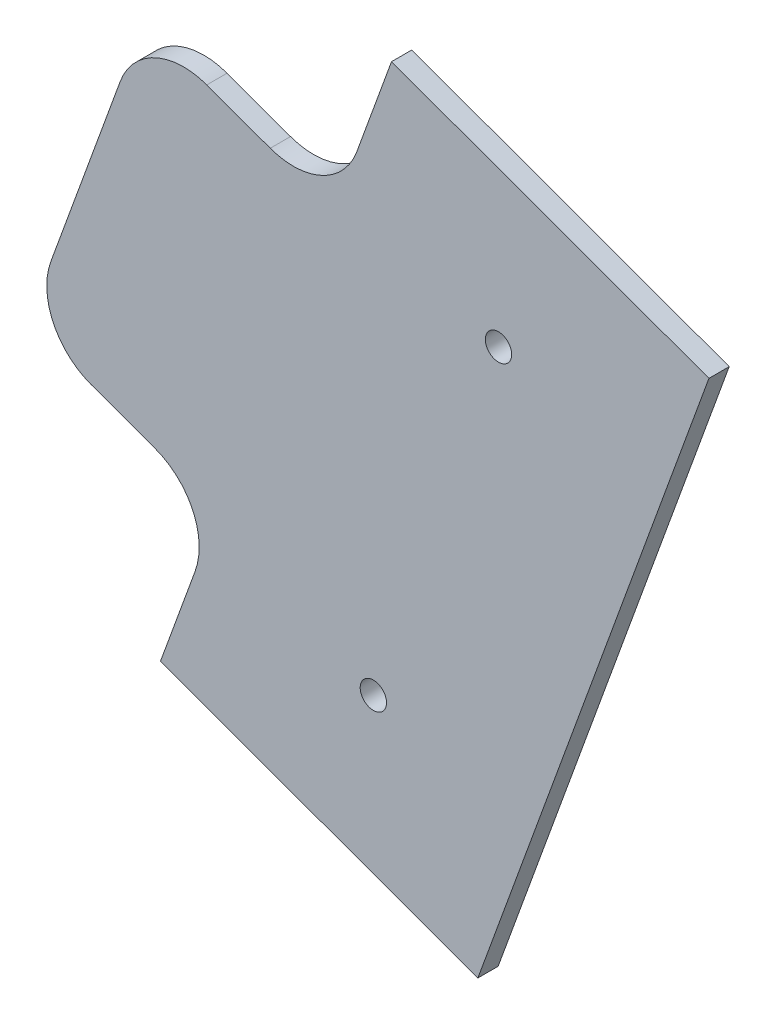
ISO-10303-21;
HEADER;
FILE_DESCRIPTION(('STEP AP214'),'2;1');
FILE_NAME('part.step','',(''),(''),'','','');
FILE_SCHEMA(('AUTOMOTIVE_DESIGN { 1 0 10303 214 1 1 1 1 }'));
ENDSEC;
DATA;
#1=APPLICATION_CONTEXT('core data for automotive mechanical design processes');
#2=APPLICATION_PROTOCOL_DEFINITION('international standard','automotive_design',2000,#1);
#3=PRODUCT_CONTEXT('',#1,'mechanical');
#4=PRODUCT('Part','Part','',(#3));
#5=PRODUCT_RELATED_PRODUCT_CATEGORY('part','',(#4));
#6=PRODUCT_DEFINITION_FORMATION('','',#4);
#7=PRODUCT_DEFINITION_CONTEXT('part definition',#1,'design');
#8=PRODUCT_DEFINITION('design','',#6,#7);
#9=PRODUCT_DEFINITION_SHAPE('','',#8);
#10=(LENGTH_UNIT() NAMED_UNIT(*) SI_UNIT(.MILLI.,.METRE.));
#11=(NAMED_UNIT(*) PLANE_ANGLE_UNIT() SI_UNIT($,.RADIAN.));
#12=(NAMED_UNIT(*) SI_UNIT($,.STERADIAN.) SOLID_ANGLE_UNIT());
#13=UNCERTAINTY_MEASURE_WITH_UNIT(LENGTH_MEASURE(1.E-05),#10,'distance_accuracy_value','');
#14=(GEOMETRIC_REPRESENTATION_CONTEXT(3) GLOBAL_UNCERTAINTY_ASSIGNED_CONTEXT((#13)) GLOBAL_UNIT_ASSIGNED_CONTEXT((#10,
#11,#12)) REPRESENTATION_CONTEXT('',''));
#15=CARTESIAN_POINT('',(0.,0.,0.));
#16=DIRECTION('',(0.,0.,1.));
#17=DIRECTION('',(1.,0.,0.));
#18=AXIS2_PLACEMENT_3D('',#15,#16,#17);
#19=CARTESIAN_POINT('',(319.823700532038,684.166597364594,3.));
#20=DIRECTION('',(0.939692620785909,-0.342020143325666,0.));
#21=DIRECTION('',(0.342020143325666,0.939692620785909,0.));
#22=AXIS2_PLACEMENT_3D('',#19,#20,#21);
#23=PLANE('',#22);
#24=DIRECTION('',(-0.342020143325666,-0.939692620785909,0.));
#25=VECTOR('',#24,1.);
#26=CARTESIAN_POINT('',(319.823700532038,684.166597364594,3.));
#27=LINE('',#26,#25);
#28=CARTESIAN_POINT('',(324.954002681923,698.261986676383,3.));
#29=VERTEX_POINT('',#28);
#30=CARTESIAN_POINT('',(319.823700532038,684.166597364594,3.));
#31=VERTEX_POINT('',#30);
#32=EDGE_CURVE('E148',#29,#31,#27,.T.);
#33=ORIENTED_EDGE('',*,*,#32,.F.);
#34=DIRECTION('',(0.,0.,1.));
#35=VECTOR('',#34,1.);
#36=CARTESIAN_POINT('',(324.954002681923,698.261986676383,3.));
#37=LINE('',#36,#35);
#38=CARTESIAN_POINT('',(324.954002681923,698.261986676383,0.));
#39=VERTEX_POINT('',#38);
#40=EDGE_CURVE('E185',#29,#39,#37,.F.);
#41=ORIENTED_EDGE('',*,*,#40,.T.);
#42=DIRECTION('',(-0.342020143325666,-0.939692620785909,0.));
#43=VECTOR('',#42,1.);
#44=CARTESIAN_POINT('',(319.823700532038,684.166597364594,0.));
#45=LINE('',#44,#43);
#46=CARTESIAN_POINT('',(319.823700532038,684.166597364594,0.));
#47=VERTEX_POINT('',#46);
#48=EDGE_CURVE('E211',#39,#47,#45,.T.);
#49=ORIENTED_EDGE('',*,*,#48,.T.);
#50=DIRECTION('',(0.,0.,-1.));
#51=VECTOR('',#50,1.);
#52=CARTESIAN_POINT('',(319.823700532038,684.166597364594,3.));
#53=LINE('',#52,#51);
#54=EDGE_CURVE('E217',#31,#47,#53,.T.);
#55=ORIENTED_EDGE('',*,*,#54,.F.);
#56=EDGE_LOOP('',(#33,#41,#49,#55));
#57=FACE_BOUND('',#56,.T.);
#58=ADVANCED_FACE('F41',(#57),#23,.F.);
#59=CARTESIAN_POINT('',(366.808331571333,667.065590198311,3.));
#60=DIRECTION('',(0.342020143325665,0.93969262078591,0.));
#61=DIRECTION('',(-0.93969262078591,0.342020143325665,0.));
#62=AXIS2_PLACEMENT_3D('',#59,#60,#61);
#63=PLANE('',#62);
#64=DIRECTION('',(0.93969262078591,-0.342020143325665,0.));
#65=VECTOR('',#64,1.);
#66=CARTESIAN_POINT('',(366.808331571333,667.065590198311,0.));
#67=LINE('',#66,#65);
#68=CARTESIAN_POINT('',(366.808331571333,667.065590198311,0.));
#69=VERTEX_POINT('',#68);
#70=EDGE_CURVE('E156',#47,#69,#67,.T.);
#71=ORIENTED_EDGE('',*,*,#70,.T.);
#72=DIRECTION('',(0.,0.,-1.));
#73=VECTOR('',#72,1.);
#74=CARTESIAN_POINT('',(366.808331571333,667.065590198311,3.));
#75=LINE('',#74,#73);
#76=CARTESIAN_POINT('',(366.808331571333,667.065590198311,3.));
#77=VERTEX_POINT('',#76);
#78=EDGE_CURVE('E135',#77,#69,#75,.T.);
#79=ORIENTED_EDGE('',*,*,#78,.F.);
#80=DIRECTION('',(0.93969262078591,-0.342020143325665,0.));
#81=VECTOR('',#80,1.);
#82=CARTESIAN_POINT('',(366.808331571333,667.065590198311,3.));
#83=LINE('',#82,#81);
#84=EDGE_CURVE('E142',#31,#77,#83,.T.);
#85=ORIENTED_EDGE('',*,*,#84,.F.);
#86=ORIENTED_EDGE('',*,*,#54,.T.);
#87=EDGE_LOOP('',(#71,#79,#85,#86));
#88=FACE_BOUND('',#87,.T.);
#89=ADVANCED_FACE('F154',(#88),#63,.F.);
#90=CARTESIAN_POINT('',(366.808331571333,667.065590198311,3.));
#91=DIRECTION('',(-0.939692620785909,0.342020143325666,0.));
#92=DIRECTION('',(-0.342020143325666,-0.939692620785909,0.));
#93=AXIS2_PLACEMENT_3D('',#90,#91,#92);
#94=PLANE('',#93);
#95=DIRECTION('',(0.342020143325666,0.939692620785909,0.));
#96=VECTOR('',#95,1.);
#97=CARTESIAN_POINT('',(366.808331571333,667.065590198311,0.));
#98=LINE('',#97,#96);
#99=CARTESIAN_POINT('',(401.0103459039,761.034852276902,0.));
#100=VERTEX_POINT('',#99);
#101=EDGE_CURVE('E221',#69,#100,#98,.T.);
#102=ORIENTED_EDGE('',*,*,#101,.T.);
#103=DIRECTION('',(0.,0.,-1.));
#104=VECTOR('',#103,1.);
#105=CARTESIAN_POINT('',(401.0103459039,761.034852276902,3.));
#106=LINE('',#105,#104);
#107=CARTESIAN_POINT('',(401.0103459039,761.034852276902,3.));
#108=VERTEX_POINT('',#107);
#109=EDGE_CURVE('E138',#108,#100,#106,.T.);
#110=ORIENTED_EDGE('',*,*,#109,.F.);
#111=DIRECTION('',(0.342020143325666,0.939692620785909,0.));
#112=VECTOR('',#111,1.);
#113=CARTESIAN_POINT('',(366.808331571333,667.065590198311,3.));
#114=LINE('',#113,#112);
#115=EDGE_CURVE('E131',#77,#108,#114,.T.);
#116=ORIENTED_EDGE('',*,*,#115,.F.);
#117=ORIENTED_EDGE('',*,*,#78,.T.);
#118=EDGE_LOOP('',(#102,#110,#116,#117));
#119=FACE_BOUND('',#118,.T.);
#120=ADVANCED_FACE('F133',(#119),#94,.F.);
#121=CARTESIAN_POINT('',(401.0103459039,761.034852276902,3.));
#122=DIRECTION('',(-0.342020143325665,-0.93969262078591,0.));
#123=DIRECTION('',(0.93969262078591,-0.342020143325665,0.));
#124=AXIS2_PLACEMENT_3D('',#121,#122,#123);
#125=PLANE('',#124);
#126=DIRECTION('',(-0.93969262078591,0.342020143325665,0.));
#127=VECTOR('',#126,1.);
#128=CARTESIAN_POINT('',(401.0103459039,761.034852276902,0.));
#129=LINE('',#128,#127);
#130=CARTESIAN_POINT('',(354.025714864604,778.135859443185,0.));
#131=VERTEX_POINT('',#130);
#132=EDGE_CURVE('E213',#100,#131,#129,.T.);
#133=ORIENTED_EDGE('',*,*,#132,.T.);
#134=DIRECTION('',(0.,0.,-1.));
#135=VECTOR('',#134,1.);
#136=CARTESIAN_POINT('',(354.025714864604,778.135859443185,3.));
#137=LINE('',#136,#135);
#138=CARTESIAN_POINT('',(354.025714864604,778.135859443185,3.));
#139=VERTEX_POINT('',#138);
#140=EDGE_CURVE('E161',#139,#131,#137,.T.);
#141=ORIENTED_EDGE('',*,*,#140,.F.);
#142=DIRECTION('',(-0.93969262078591,0.342020143325665,0.));
#143=VECTOR('',#142,1.);
#144=CARTESIAN_POINT('',(401.0103459039,761.034852276902,3.));
#145=LINE('',#144,#143);
#146=EDGE_CURVE('E141',#108,#139,#145,.T.);
#147=ORIENTED_EDGE('',*,*,#146,.F.);
#148=ORIENTED_EDGE('',*,*,#109,.T.);
#149=EDGE_LOOP('',(#133,#141,#147,#148));
#150=FACE_BOUND('',#149,.T.);
#151=ADVANCED_FACE('F224',(#150),#125,.F.);
#152=CARTESIAN_POINT('',(348.895412714719,764.040470131397,0.));
#153=VERTEX_POINT('',#152);
#154=EDGE_CURVE('E152',#131,#153,#45,.T.);
#155=ORIENTED_EDGE('',*,*,#154,.T.);
#156=DIRECTION('',(0.,0.,1.));
#157=VECTOR('',#156,1.);
#158=CARTESIAN_POINT('',(348.895412714719,764.040470131397,3.));
#159=LINE('',#158,#157);
#160=CARTESIAN_POINT('',(348.895412714719,764.040470131397,3.));
#161=VERTEX_POINT('',#160);
#162=EDGE_CURVE('E187',#153,#161,#159,.T.);
#163=ORIENTED_EDGE('',*,*,#162,.T.);
#164=EDGE_CURVE('E196',#139,#161,#27,.T.);
#165=ORIENTED_EDGE('',*,*,#164,.F.);
#166=ORIENTED_EDGE('',*,*,#140,.T.);
#167=EDGE_LOOP('',(#155,#163,#165,#166));
#168=FACE_BOUND('',#167,.T.);
#169=ADVANCED_FACE('F207',(#168),#23,.F.);
#170=CARTESIAN_POINT('',(0.,0.,3.));
#171=DIRECTION('',(0.,0.,-1.));
#172=DIRECTION('',(-1.,0.,0.));
#173=AXIS2_PLACEMENT_3D('',#170,#171,#172);
#174=PLANE('',#173);
#175=CARTESIAN_POINT('',(351.338243096391,695.576064032886,3.));
#176=DIRECTION('',(0.,0.,1.));
#177=DIRECTION('',(1.,0.,0.));
#178=AXIS2_PLACEMENT_3D('',#175,#176,#177);
#179=CIRCLE('',#178,1.95000000000125);
#180=CARTESIAN_POINT('',(353.288243096393,695.576064032886,3.));
#181=VERTEX_POINT('',#180);
#182=EDGE_CURVE('E222',#181,#181,#179,.T.);
#183=ORIENTED_EDGE('',*,*,#182,.F.);
#184=EDGE_LOOP('',(#183));
#185=FACE_BOUND('',#184,.T.);
#186=CARTESIAN_POINT('',(369.862047426167,749.482173827159,3.));
#187=DIRECTION('',(0.,0.,1.));
#188=DIRECTION('',(1.,0.,0.));
#189=AXIS2_PLACEMENT_3D('',#186,#187,#188);
#190=CIRCLE('',#189,1.95000000000114);
#191=CARTESIAN_POINT('',(371.812047426168,749.482173827159,3.));
#192=VERTEX_POINT('',#191);
#193=EDGE_CURVE('E254',#192,#192,#190,.T.);
#194=ORIENTED_EDGE('',*,*,#193,.F.);
#195=EDGE_LOOP('',(#194));
#196=FACE_BOUND('',#195,.T.);
#197=DIRECTION('',(-0.93969262078591,0.342020143325665,0.));
#198=VECTOR('',#197,1.);
#199=CARTESIAN_POINT('',(345.475211281463,754.643543923538,3.));
#200=LINE('',#199,#198);
#201=CARTESIAN_POINT('',(336.078285073603,758.063745356794,3.));
#202=VERTEX_POINT('',#201);
#203=CARTESIAN_POINT('',(326.681358865744,761.483946790051,3.));
#204=VERTEX_POINT('',#203);
#205=EDGE_CURVE('E194',#202,#204,#200,.T.);
#206=ORIENTED_EDGE('',*,*,#205,.T.);
#207=CARTESIAN_POINT('',(323.261157432488,752.087020582192,3.));
#208=DIRECTION('',(0.,0.,-1.));
#209=DIRECTION('',(-1.,0.,0.));
#210=AXIS2_PLACEMENT_3D('',#207,#208,#209);
#211=CIRCLE('',#210,10.);
#212=CARTESIAN_POINT('',(313.864231224629,755.507222015448,3.));
#213=VERTEX_POINT('',#212);
#214=EDGE_CURVE('E169',#204,#213,#211,.F.);
#215=ORIENTED_EDGE('',*,*,#214,.T.);
#216=DIRECTION('',(-0.342020143325664,-0.93969262078591,0.));
#217=VECTOR('',#216,1.);
#218=CARTESIAN_POINT('',(317.284432657885,764.904148223307,3.));
#219=LINE('',#218,#217);
#220=CARTESIAN_POINT('',(303.603626924859,727.316443391871,3.));
#221=VERTEX_POINT('',#220);
#222=EDGE_CURVE('E204',#213,#221,#219,.T.);
#223=ORIENTED_EDGE('',*,*,#222,.T.);
#224=CARTESIAN_POINT('',(313.000553132718,723.896241958614,3.));
#225=DIRECTION('',(0.,0.,-1.));
#226=DIRECTION('',(-1.,0.,0.));
#227=AXIS2_PLACEMENT_3D('',#224,#225,#226);
#228=CIRCLE('',#227,10.);
#229=CARTESIAN_POINT('',(309.580351699461,714.499315750755,3.));
#230=VERTEX_POINT('',#229);
#231=EDGE_CURVE('E167',#221,#230,#228,.F.);
#232=ORIENTED_EDGE('',*,*,#231,.T.);
#233=DIRECTION('',(0.939692620785909,-0.342020143325666,0.));
#234=VECTOR('',#233,1.);
#235=CARTESIAN_POINT('',(300.183425491602,717.919517184012,3.));
#236=LINE('',#235,#234);
#237=CARTESIAN_POINT('',(318.97727790732,711.079114317499,3.));
#238=VERTEX_POINT('',#237);
#239=EDGE_CURVE('E236',#230,#238,#236,.T.);
#240=ORIENTED_EDGE('',*,*,#239,.T.);
#241=CARTESIAN_POINT('',(315.557076474063,701.682188109639,3.));
#242=DIRECTION('',(0.,0.,-1.));
#243=DIRECTION('',(-1.,0.,0.));
#244=AXIS2_PLACEMENT_3D('',#241,#242,#243);
#245=CIRCLE('',#244,10.);
#246=EDGE_CURVE('E190',#238,#29,#245,.T.);
#247=ORIENTED_EDGE('',*,*,#246,.T.);
#248=ORIENTED_EDGE('',*,*,#32,.T.);
#249=ORIENTED_EDGE('',*,*,#84,.T.);
#250=ORIENTED_EDGE('',*,*,#115,.T.);
#251=ORIENTED_EDGE('',*,*,#146,.T.);
#252=ORIENTED_EDGE('',*,*,#164,.T.);
#253=CARTESIAN_POINT('',(339.49848650686,767.460671564653,3.));
#254=DIRECTION('',(0.,0.,-1.));
#255=DIRECTION('',(-1.,0.,0.));
#256=AXIS2_PLACEMENT_3D('',#253,#254,#255);
#257=CIRCLE('',#256,10.);
#258=EDGE_CURVE('E49',#161,#202,#257,.T.);
#259=ORIENTED_EDGE('',*,*,#258,.T.);
#260=EDGE_LOOP('',(#206,#215,#223,#232,#240,#247,#248,#249,#250,#251,#252,#259));
#261=FACE_BOUND('',#260,.T.);
#262=ADVANCED_FACE('F146',(#185,#196,#261),#174,.F.);
#263=CARTESIAN_POINT('',(0.,0.,0.));
#264=DIRECTION('',(0.,0.,-1.));
#265=DIRECTION('',(-1.,0.,0.));
#266=AXIS2_PLACEMENT_3D('',#263,#264,#265);
#267=PLANE('',#266);
#268=CARTESIAN_POINT('',(351.338243096391,695.576064032886,0.));
#269=DIRECTION('',(0.,0.,-1.));
#270=DIRECTION('',(-1.,0.,0.));
#271=AXIS2_PLACEMENT_3D('',#268,#269,#270);
#272=CIRCLE('',#271,1.95000000000125);
#273=CARTESIAN_POINT('',(353.288243096393,695.576064032886,0.));
#274=VERTEX_POINT('',#273);
#275=EDGE_CURVE('E248',#274,#274,#272,.F.);
#276=ORIENTED_EDGE('',*,*,#275,.T.);
#277=EDGE_LOOP('',(#276));
#278=FACE_BOUND('',#277,.T.);
#279=CARTESIAN_POINT('',(369.862047426167,749.482173827159,0.));
#280=DIRECTION('',(0.,0.,-1.));
#281=DIRECTION('',(-1.,0.,0.));
#282=AXIS2_PLACEMENT_3D('',#279,#280,#281);
#283=CIRCLE('',#282,1.95000000000114);
#284=CARTESIAN_POINT('',(371.812047426168,749.482173827159,0.));
#285=VERTEX_POINT('',#284);
#286=EDGE_CURVE('E251',#285,#285,#283,.F.);
#287=ORIENTED_EDGE('',*,*,#286,.T.);
#288=EDGE_LOOP('',(#287));
#289=FACE_BOUND('',#288,.T.);
#290=DIRECTION('',(-0.342020143325664,-0.93969262078591,0.));
#291=VECTOR('',#290,1.);
#292=CARTESIAN_POINT('',(317.284432657885,764.904148223307,0.));
#293=LINE('',#292,#291);
#294=CARTESIAN_POINT('',(313.864231224629,755.507222015448,0.));
#295=VERTEX_POINT('',#294);
#296=CARTESIAN_POINT('',(303.603626924859,727.316443391871,0.));
#297=VERTEX_POINT('',#296);
#298=EDGE_CURVE('E242',#295,#297,#293,.T.);
#299=ORIENTED_EDGE('',*,*,#298,.F.);
#300=CARTESIAN_POINT('',(323.261157432488,752.087020582192,0.));
#301=DIRECTION('',(0.,0.,-1.));
#302=DIRECTION('',(-1.,0.,0.));
#303=AXIS2_PLACEMENT_3D('',#300,#301,#302);
#304=CIRCLE('',#303,10.);
#305=CARTESIAN_POINT('',(326.681358865744,761.483946790051,0.));
#306=VERTEX_POINT('',#305);
#307=EDGE_CURVE('E178',#295,#306,#304,.T.);
#308=ORIENTED_EDGE('',*,*,#307,.T.);
#309=DIRECTION('',(-0.93969262078591,0.342020143325665,0.));
#310=VECTOR('',#309,1.);
#311=CARTESIAN_POINT('',(345.475211281463,754.643543923538,0.));
#312=LINE('',#311,#310);
#313=CARTESIAN_POINT('',(336.078285073603,758.063745356794,0.));
#314=VERTEX_POINT('',#313);
#315=EDGE_CURVE('E240',#314,#306,#312,.T.);
#316=ORIENTED_EDGE('',*,*,#315,.F.);
#317=CARTESIAN_POINT('',(339.49848650686,767.460671564653,0.));
#318=DIRECTION('',(0.,0.,-1.));
#319=DIRECTION('',(-1.,0.,0.));
#320=AXIS2_PLACEMENT_3D('',#317,#318,#319);
#321=CIRCLE('',#320,10.);
#322=EDGE_CURVE('E11',#314,#153,#321,.F.);
#323=ORIENTED_EDGE('',*,*,#322,.T.);
#324=ORIENTED_EDGE('',*,*,#154,.F.);
#325=ORIENTED_EDGE('',*,*,#132,.F.);
#326=ORIENTED_EDGE('',*,*,#101,.F.);
#327=ORIENTED_EDGE('',*,*,#70,.F.);
#328=ORIENTED_EDGE('',*,*,#48,.F.);
#329=CARTESIAN_POINT('',(315.557076474063,701.682188109639,0.));
#330=DIRECTION('',(0.,0.,-1.));
#331=DIRECTION('',(-1.,0.,0.));
#332=AXIS2_PLACEMENT_3D('',#329,#330,#331);
#333=CIRCLE('',#332,10.);
#334=CARTESIAN_POINT('',(318.97727790732,711.079114317499,0.));
#335=VERTEX_POINT('',#334);
#336=EDGE_CURVE('E61',#39,#335,#333,.F.);
#337=ORIENTED_EDGE('',*,*,#336,.T.);
#338=DIRECTION('',(0.939692620785909,-0.342020143325666,0.));
#339=VECTOR('',#338,1.);
#340=CARTESIAN_POINT('',(300.183425491602,717.919517184012,0.));
#341=LINE('',#340,#339);
#342=CARTESIAN_POINT('',(309.580351699461,714.499315750755,0.));
#343=VERTEX_POINT('',#342);
#344=EDGE_CURVE('E238',#343,#335,#341,.T.);
#345=ORIENTED_EDGE('',*,*,#344,.F.);
#346=CARTESIAN_POINT('',(313.000553132718,723.896241958614,0.));
#347=DIRECTION('',(0.,0.,-1.));
#348=DIRECTION('',(-1.,0.,0.));
#349=AXIS2_PLACEMENT_3D('',#346,#347,#348);
#350=CIRCLE('',#349,10.);
#351=EDGE_CURVE('E176',#343,#297,#350,.T.);
#352=ORIENTED_EDGE('',*,*,#351,.T.);
#353=EDGE_LOOP('',(#299,#308,#316,#323,#324,#325,#326,#327,#328,#337,#345,#352));
#354=FACE_BOUND('',#353,.T.);
#355=ADVANCED_FACE('F226',(#278,#289,#354),#267,.T.);
#356=CARTESIAN_POINT('',(369.862047426167,749.482173827159,-0.00100000000000013));
#357=DIRECTION('',(0.,0.,1.));
#358=DIRECTION('',(1.,0.,0.));
#359=AXIS2_PLACEMENT_3D('',#356,#357,#358);
#360=CYLINDRICAL_SURFACE('',#359,1.95000000000114);
#361=CARTESIAN_POINT('',(371.812047426168,749.482173827159,0.));
#362=CARTESIAN_POINT('',(371.812047426168,749.482173827159,0.03125));
#363=CARTESIAN_POINT('',(371.812047426168,749.482173827159,0.0625));
#364=CARTESIAN_POINT('',(371.812047426168,749.482173827159,0.125));
#365=CARTESIAN_POINT('',(371.812047426168,749.482173827159,0.15625));
#366=CARTESIAN_POINT('',(371.812047426168,749.482173827159,0.21875));
#367=CARTESIAN_POINT('',(371.812047426168,749.482173827159,0.25));
#368=CARTESIAN_POINT('',(371.812047426168,749.482173827159,0.3125));
#369=CARTESIAN_POINT('',(371.812047426168,749.482173827159,0.34375));
#370=CARTESIAN_POINT('',(371.812047426168,749.482173827159,0.40625));
#371=CARTESIAN_POINT('',(371.812047426168,749.482173827159,0.4375));
#372=CARTESIAN_POINT('',(371.812047426168,749.482173827159,0.5));
#373=CARTESIAN_POINT('',(371.812047426168,749.482173827159,0.53125));
#374=CARTESIAN_POINT('',(371.812047426168,749.482173827159,0.59375));
#375=CARTESIAN_POINT('',(371.812047426168,749.482173827159,0.625));
#376=CARTESIAN_POINT('',(371.812047426168,749.482173827159,0.6875));
#377=CARTESIAN_POINT('',(371.812047426168,749.482173827159,0.71875));
#378=CARTESIAN_POINT('',(371.812047426168,749.482173827159,0.78125));
#379=CARTESIAN_POINT('',(371.812047426168,749.482173827159,0.8125));
#380=CARTESIAN_POINT('',(371.812047426168,749.482173827159,0.875));
#381=CARTESIAN_POINT('',(371.812047426168,749.482173827159,0.90625));
#382=CARTESIAN_POINT('',(371.812047426168,749.482173827159,0.96875));
#383=CARTESIAN_POINT('',(371.812047426168,749.482173827159,1.));
#384=CARTESIAN_POINT('',(371.812047426168,749.482173827159,1.0625));
#385=CARTESIAN_POINT('',(371.812047426168,749.482173827159,1.09375));
#386=CARTESIAN_POINT('',(371.812047426168,749.482173827159,1.15625));
#387=CARTESIAN_POINT('',(371.812047426168,749.482173827159,1.1875));
#388=CARTESIAN_POINT('',(371.812047426168,749.482173827159,1.25));
#389=CARTESIAN_POINT('',(371.812047426168,749.482173827159,1.28125));
#390=CARTESIAN_POINT('',(371.812047426168,749.482173827159,1.34375));
#391=CARTESIAN_POINT('',(371.812047426168,749.482173827159,1.375));
#392=CARTESIAN_POINT('',(371.812047426168,749.482173827159,1.4375));
#393=CARTESIAN_POINT('',(371.812047426168,749.482173827159,1.46875));
#394=CARTESIAN_POINT('',(371.812047426168,749.482173827159,1.53125));
#395=CARTESIAN_POINT('',(371.812047426168,749.482173827159,1.5625));
#396=CARTESIAN_POINT('',(371.812047426168,749.482173827159,1.625));
#397=CARTESIAN_POINT('',(371.812047426168,749.482173827159,1.65625));
#398=CARTESIAN_POINT('',(371.812047426168,749.482173827159,1.71875));
#399=CARTESIAN_POINT('',(371.812047426168,749.482173827159,1.75));
#400=CARTESIAN_POINT('',(371.812047426168,749.482173827159,1.8125));
#401=CARTESIAN_POINT('',(371.812047426168,749.482173827159,1.84375));
#402=CARTESIAN_POINT('',(371.812047426168,749.482173827159,1.90625));
#403=CARTESIAN_POINT('',(371.812047426168,749.482173827159,1.9375));
#404=CARTESIAN_POINT('',(371.812047426168,749.482173827159,2.));
#405=CARTESIAN_POINT('',(371.812047426168,749.482173827159,2.03125));
#406=CARTESIAN_POINT('',(371.812047426168,749.482173827159,2.09375));
#407=CARTESIAN_POINT('',(371.812047426168,749.482173827159,2.125));
#408=CARTESIAN_POINT('',(371.812047426168,749.482173827159,2.1875));
#409=CARTESIAN_POINT('',(371.812047426168,749.482173827159,2.21875));
#410=CARTESIAN_POINT('',(371.812047426168,749.482173827159,2.28125));
#411=CARTESIAN_POINT('',(371.812047426168,749.482173827159,2.3125));
#412=CARTESIAN_POINT('',(371.812047426168,749.482173827159,2.375));
#413=CARTESIAN_POINT('',(371.812047426168,749.482173827159,2.40625));
#414=CARTESIAN_POINT('',(371.812047426168,749.482173827159,2.46875));
#415=CARTESIAN_POINT('',(371.812047426168,749.482173827159,2.5));
#416=CARTESIAN_POINT('',(371.812047426168,749.482173827159,2.5625));
#417=CARTESIAN_POINT('',(371.812047426168,749.482173827159,2.59375));
#418=CARTESIAN_POINT('',(371.812047426168,749.482173827159,2.65625));
#419=CARTESIAN_POINT('',(371.812047426168,749.482173827159,2.6875));
#420=CARTESIAN_POINT('',(371.812047426168,749.482173827159,2.75));
#421=CARTESIAN_POINT('',(371.812047426168,749.482173827159,2.78125));
#422=CARTESIAN_POINT('',(371.812047426168,749.482173827159,2.84375));
#423=CARTESIAN_POINT('',(371.812047426168,749.482173827159,2.875));
#424=CARTESIAN_POINT('',(371.812047426168,749.482173827159,2.9375));
#425=CARTESIAN_POINT('',(371.812047426168,749.482173827159,2.96875));
#426=CARTESIAN_POINT('',(371.812047426168,749.482173827159,3.));
#427=B_SPLINE_CURVE_WITH_KNOTS('',3,(#361,#362,#363,#364,#365,#366,#367,#368,#369,#370,#371,
#372,#373,#374,#375,#376,#377,#378,#379,#380,#381,#382,#383,#384,#385,#386,#387,#388,#389,#390,
#391,#392,#393,#394,#395,#396,#397,#398,#399,#400,#401,#402,#403,#404,#405,#406,#407,#408,#409,
#410,#411,#412,#413,#414,#415,#416,#417,#418,#419,#420,#421,#422,#423,#424,#425,#426),
.UNSPECIFIED.,.F.,.F.,(4,2,2,2,2,2,2,2,2,2,2,2,2,2,2,2,2,2,2,2,2,2,2,2,2,2,2,2,2,2,2,2,4),(0.,
0.09375,0.1875,0.28125,0.375,0.46875,0.5625,0.65625,0.75,0.84375,0.9375,1.03125,1.125,1.21875,
1.3125,1.40625,1.5,1.59375,1.6875,1.78125,1.875,1.96875,2.0625,2.15625,2.25,2.34375,2.4375,
2.53125,2.625,2.71875,2.8125,2.90625,3.),.UNSPECIFIED.);
#428=EDGE_CURVE('BSEAM331',#285,#192,#427,.T.);
#429=ORIENTED_EDGE('',*,*,#286,.F.);
#430=ORIENTED_EDGE('',*,*,#193,.T.);
#431=ORIENTED_EDGE('',*,*,#428,.T.);
#432=ORIENTED_EDGE('',*,*,#428,.F.);
#433=EDGE_LOOP('',(#429,#431,#430,#432));
#434=FACE_BOUND('',#433,.T.);
#435=ADVANCED_FACE('F331',(#434),#360,.F.);
#436=CARTESIAN_POINT('',(351.338243096391,695.576064032886,-0.00100000000000013));
#437=DIRECTION('',(0.,0.,1.));
#438=DIRECTION('',(1.,0.,0.));
#439=AXIS2_PLACEMENT_3D('',#436,#437,#438);
#440=CYLINDRICAL_SURFACE('',#439,1.95000000000125);
#441=CARTESIAN_POINT('',(353.288243096393,695.576064032886,0.));
#442=CARTESIAN_POINT('',(353.288243096393,695.576064032886,0.03125));
#443=CARTESIAN_POINT('',(353.288243096393,695.576064032886,0.0625));
#444=CARTESIAN_POINT('',(353.288243096393,695.576064032886,0.125));
#445=CARTESIAN_POINT('',(353.288243096393,695.576064032886,0.15625));
#446=CARTESIAN_POINT('',(353.288243096393,695.576064032886,0.21875));
#447=CARTESIAN_POINT('',(353.288243096393,695.576064032886,0.25));
#448=CARTESIAN_POINT('',(353.288243096393,695.576064032886,0.3125));
#449=CARTESIAN_POINT('',(353.288243096393,695.576064032886,0.34375));
#450=CARTESIAN_POINT('',(353.288243096393,695.576064032886,0.40625));
#451=CARTESIAN_POINT('',(353.288243096393,695.576064032886,0.4375));
#452=CARTESIAN_POINT('',(353.288243096393,695.576064032886,0.5));
#453=CARTESIAN_POINT('',(353.288243096393,695.576064032886,0.53125));
#454=CARTESIAN_POINT('',(353.288243096393,695.576064032886,0.59375));
#455=CARTESIAN_POINT('',(353.288243096393,695.576064032886,0.625));
#456=CARTESIAN_POINT('',(353.288243096393,695.576064032886,0.6875));
#457=CARTESIAN_POINT('',(353.288243096393,695.576064032886,0.71875));
#458=CARTESIAN_POINT('',(353.288243096393,695.576064032886,0.78125));
#459=CARTESIAN_POINT('',(353.288243096393,695.576064032886,0.8125));
#460=CARTESIAN_POINT('',(353.288243096393,695.576064032886,0.875));
#461=CARTESIAN_POINT('',(353.288243096393,695.576064032886,0.90625));
#462=CARTESIAN_POINT('',(353.288243096393,695.576064032886,0.96875));
#463=CARTESIAN_POINT('',(353.288243096393,695.576064032886,1.));
#464=CARTESIAN_POINT('',(353.288243096393,695.576064032886,1.0625));
#465=CARTESIAN_POINT('',(353.288243096393,695.576064032886,1.09375));
#466=CARTESIAN_POINT('',(353.288243096393,695.576064032886,1.15625));
#467=CARTESIAN_POINT('',(353.288243096393,695.576064032886,1.1875));
#468=CARTESIAN_POINT('',(353.288243096393,695.576064032886,1.25));
#469=CARTESIAN_POINT('',(353.288243096393,695.576064032886,1.28125));
#470=CARTESIAN_POINT('',(353.288243096393,695.576064032886,1.34375));
#471=CARTESIAN_POINT('',(353.288243096393,695.576064032886,1.375));
#472=CARTESIAN_POINT('',(353.288243096393,695.576064032886,1.4375));
#473=CARTESIAN_POINT('',(353.288243096393,695.576064032886,1.46875));
#474=CARTESIAN_POINT('',(353.288243096393,695.576064032886,1.53125));
#475=CARTESIAN_POINT('',(353.288243096393,695.576064032886,1.5625));
#476=CARTESIAN_POINT('',(353.288243096393,695.576064032886,1.625));
#477=CARTESIAN_POINT('',(353.288243096393,695.576064032886,1.65625));
#478=CARTESIAN_POINT('',(353.288243096393,695.576064032886,1.71875));
#479=CARTESIAN_POINT('',(353.288243096393,695.576064032886,1.75));
#480=CARTESIAN_POINT('',(353.288243096393,695.576064032886,1.8125));
#481=CARTESIAN_POINT('',(353.288243096393,695.576064032886,1.84375));
#482=CARTESIAN_POINT('',(353.288243096393,695.576064032886,1.90625));
#483=CARTESIAN_POINT('',(353.288243096393,695.576064032886,1.9375));
#484=CARTESIAN_POINT('',(353.288243096393,695.576064032886,2.));
#485=CARTESIAN_POINT('',(353.288243096393,695.576064032886,2.03125));
#486=CARTESIAN_POINT('',(353.288243096393,695.576064032886,2.09375));
#487=CARTESIAN_POINT('',(353.288243096393,695.576064032886,2.125));
#488=CARTESIAN_POINT('',(353.288243096393,695.576064032886,2.1875));
#489=CARTESIAN_POINT('',(353.288243096393,695.576064032886,2.21875));
#490=CARTESIAN_POINT('',(353.288243096393,695.576064032886,2.28125));
#491=CARTESIAN_POINT('',(353.288243096393,695.576064032886,2.3125));
#492=CARTESIAN_POINT('',(353.288243096393,695.576064032886,2.375));
#493=CARTESIAN_POINT('',(353.288243096393,695.576064032886,2.40625));
#494=CARTESIAN_POINT('',(353.288243096393,695.576064032886,2.46875));
#495=CARTESIAN_POINT('',(353.288243096393,695.576064032886,2.5));
#496=CARTESIAN_POINT('',(353.288243096393,695.576064032886,2.5625));
#497=CARTESIAN_POINT('',(353.288243096393,695.576064032886,2.59375));
#498=CARTESIAN_POINT('',(353.288243096393,695.576064032886,2.65625));
#499=CARTESIAN_POINT('',(353.288243096393,695.576064032886,2.6875));
#500=CARTESIAN_POINT('',(353.288243096393,695.576064032886,2.75));
#501=CARTESIAN_POINT('',(353.288243096393,695.576064032886,2.78125));
#502=CARTESIAN_POINT('',(353.288243096393,695.576064032886,2.84375));
#503=CARTESIAN_POINT('',(353.288243096393,695.576064032886,2.875));
#504=CARTESIAN_POINT('',(353.288243096393,695.576064032886,2.9375));
#505=CARTESIAN_POINT('',(353.288243096393,695.576064032886,2.96875));
#506=CARTESIAN_POINT('',(353.288243096393,695.576064032886,3.));
#507=B_SPLINE_CURVE_WITH_KNOTS('',3,(#441,#442,#443,#444,#445,#446,#447,#448,#449,#450,#451,
#452,#453,#454,#455,#456,#457,#458,#459,#460,#461,#462,#463,#464,#465,#466,#467,#468,#469,#470,
#471,#472,#473,#474,#475,#476,#477,#478,#479,#480,#481,#482,#483,#484,#485,#486,#487,#488,#489,
#490,#491,#492,#493,#494,#495,#496,#497,#498,#499,#500,#501,#502,#503,#504,#505,#506),
.UNSPECIFIED.,.F.,.F.,(4,2,2,2,2,2,2,2,2,2,2,2,2,2,2,2,2,2,2,2,2,2,2,2,2,2,2,2,2,2,2,2,4),(0.,
0.09375,0.1875,0.28125,0.375,0.46875,0.5625,0.65625,0.75,0.84375,0.9375,1.03125,1.125,1.21875,
1.3125,1.40625,1.5,1.59375,1.6875,1.78125,1.875,1.96875,2.0625,2.15625,2.25,2.34375,2.4375,
2.53125,2.625,2.71875,2.8125,2.90625,3.),.UNSPECIFIED.);
#508=EDGE_CURVE('BSEAM339',#274,#181,#507,.T.);
#509=ORIENTED_EDGE('',*,*,#275,.F.);
#510=ORIENTED_EDGE('',*,*,#182,.T.);
#511=ORIENTED_EDGE('',*,*,#508,.T.);
#512=ORIENTED_EDGE('',*,*,#508,.F.);
#513=EDGE_LOOP('',(#509,#511,#510,#512));
#514=FACE_BOUND('',#513,.T.);
#515=ADVANCED_FACE('F339',(#514),#440,.F.);
#516=CARTESIAN_POINT('',(300.183425491602,717.919517184012,0.));
#517=DIRECTION('',(-0.342020143325666,-0.939692620785909,0.));
#518=DIRECTION('',(0.939692620785909,-0.342020143325666,0.));
#519=AXIS2_PLACEMENT_3D('',#516,#517,#518);
#520=PLANE('',#519);
#521=ORIENTED_EDGE('',*,*,#239,.F.);
#522=DIRECTION('',(0.,0.,1.));
#523=VECTOR('',#522,1.);
#524=CARTESIAN_POINT('',(309.580351699461,714.499315750755,0.));
#525=LINE('',#524,#523);
#526=EDGE_CURVE('E183',#230,#343,#525,.F.);
#527=ORIENTED_EDGE('',*,*,#526,.T.);
#528=ORIENTED_EDGE('',*,*,#344,.T.);
#529=DIRECTION('',(0.,0.,1.));
#530=VECTOR('',#529,1.);
#531=CARTESIAN_POINT('',(318.97727790732,711.079114317499,0.));
#532=LINE('',#531,#530);
#533=EDGE_CURVE('E180',#335,#238,#532,.T.);
#534=ORIENTED_EDGE('',*,*,#533,.T.);
#535=EDGE_LOOP('',(#521,#527,#528,#534));
#536=FACE_BOUND('',#535,.T.);
#537=ADVANCED_FACE('F235',(#536),#520,.T.);
#538=CARTESIAN_POINT('',(317.284432657885,764.904148223307,0.));
#539=DIRECTION('',(-0.93969262078591,0.342020143325664,0.));
#540=DIRECTION('',(-0.342020143325664,-0.93969262078591,0.));
#541=AXIS2_PLACEMENT_3D('',#538,#539,#540);
#542=PLANE('',#541);
#543=ORIENTED_EDGE('',*,*,#222,.F.);
#544=DIRECTION('',(0.,0.,1.));
#545=VECTOR('',#544,1.);
#546=CARTESIAN_POINT('',(313.864231224629,755.507222015448,0.));
#547=LINE('',#546,#545);
#548=EDGE_CURVE('E174',#213,#295,#547,.F.);
#549=ORIENTED_EDGE('',*,*,#548,.T.);
#550=ORIENTED_EDGE('',*,*,#298,.T.);
#551=DIRECTION('',(0.,0.,1.));
#552=VECTOR('',#551,1.);
#553=CARTESIAN_POINT('',(303.603626924859,727.316443391871,0.));
#554=LINE('',#553,#552);
#555=EDGE_CURVE('E171',#297,#221,#554,.T.);
#556=ORIENTED_EDGE('',*,*,#555,.T.);
#557=EDGE_LOOP('',(#543,#549,#550,#556));
#558=FACE_BOUND('',#557,.T.);
#559=ADVANCED_FACE('F264',(#558),#542,.T.);
#560=CARTESIAN_POINT('',(345.475211281463,754.643543923538,0.));
#561=DIRECTION('',(0.342020143325665,0.93969262078591,0.));
#562=DIRECTION('',(-0.93969262078591,0.342020143325665,0.));
#563=AXIS2_PLACEMENT_3D('',#560,#561,#562);
#564=PLANE('',#563);
#565=ORIENTED_EDGE('',*,*,#315,.T.);
#566=DIRECTION('',(0.,0.,1.));
#567=VECTOR('',#566,1.);
#568=CARTESIAN_POINT('',(326.681358865744,761.483946790051,0.));
#569=LINE('',#568,#567);
#570=EDGE_CURVE('E159',#306,#204,#569,.T.);
#571=ORIENTED_EDGE('',*,*,#570,.T.);
#572=ORIENTED_EDGE('',*,*,#205,.F.);
#573=DIRECTION('',(0.,0.,1.));
#574=VECTOR('',#573,1.);
#575=CARTESIAN_POINT('',(336.078285073603,758.063745356794,0.));
#576=LINE('',#575,#574);
#577=EDGE_CURVE('E157',#202,#314,#576,.F.);
#578=ORIENTED_EDGE('',*,*,#577,.T.);
#579=EDGE_LOOP('',(#565,#571,#572,#578));
#580=FACE_BOUND('',#579,.T.);
#581=ADVANCED_FACE('F202',(#580),#564,.T.);
#582=CARTESIAN_POINT('',(323.261157432488,752.087020582192,0.));
#583=DIRECTION('',(0.,0.,1.));
#584=DIRECTION('',(1.,0.,0.));
#585=AXIS2_PLACEMENT_3D('',#582,#583,#584);
#586=CYLINDRICAL_SURFACE('',#585,10.);
#587=ORIENTED_EDGE('',*,*,#307,.F.);
#588=ORIENTED_EDGE('',*,*,#548,.F.);
#589=ORIENTED_EDGE('',*,*,#214,.F.);
#590=ORIENTED_EDGE('',*,*,#570,.F.);
#591=EDGE_LOOP('',(#587,#588,#589,#590));
#592=FACE_BOUND('',#591,.T.);
#593=ADVANCED_FACE('F271',(#592),#586,.T.);
#594=CARTESIAN_POINT('',(313.000553132718,723.896241958614,0.));
#595=DIRECTION('',(0.,0.,1.));
#596=DIRECTION('',(1.,0.,0.));
#597=AXIS2_PLACEMENT_3D('',#594,#595,#596);
#598=CYLINDRICAL_SURFACE('',#597,10.);
#599=ORIENTED_EDGE('',*,*,#351,.F.);
#600=ORIENTED_EDGE('',*,*,#526,.F.);
#601=ORIENTED_EDGE('',*,*,#231,.F.);
#602=ORIENTED_EDGE('',*,*,#555,.F.);
#603=EDGE_LOOP('',(#599,#600,#601,#602));
#604=FACE_BOUND('',#603,.T.);
#605=ADVANCED_FACE('F269',(#604),#598,.T.);
#606=CARTESIAN_POINT('',(315.557076474063,701.682188109639,0.));
#607=DIRECTION('',(0.,0.,1.));
#608=DIRECTION('',(1.,0.,0.));
#609=AXIS2_PLACEMENT_3D('',#606,#607,#608);
#610=CYLINDRICAL_SURFACE('',#609,10.);
#611=ORIENTED_EDGE('',*,*,#336,.F.);
#612=ORIENTED_EDGE('',*,*,#40,.F.);
#613=ORIENTED_EDGE('',*,*,#246,.F.);
#614=ORIENTED_EDGE('',*,*,#533,.F.);
#615=EDGE_LOOP('',(#611,#612,#613,#614));
#616=FACE_BOUND('',#615,.T.);
#617=ADVANCED_FACE('F231',(#616),#610,.F.);
#618=CARTESIAN_POINT('',(339.49848650686,767.460671564653,3.));
#619=DIRECTION('',(0.,0.,1.));
#620=DIRECTION('',(1.,0.,0.));
#621=AXIS2_PLACEMENT_3D('',#618,#619,#620);
#622=CYLINDRICAL_SURFACE('',#621,10.);
#623=ORIENTED_EDGE('',*,*,#322,.F.);
#624=ORIENTED_EDGE('',*,*,#577,.F.);
#625=ORIENTED_EDGE('',*,*,#258,.F.);
#626=ORIENTED_EDGE('',*,*,#162,.F.);
#627=EDGE_LOOP('',(#623,#624,#625,#626));
#628=FACE_BOUND('',#627,.T.);
#629=ADVANCED_FACE('F43',(#628),#622,.F.);
#630=CLOSED_SHELL('',(#58,#89,#120,#151,#169,#262,#355,#435,#515,#537,#559,#581,#593,#605,#617,#629));
#631=MANIFOLD_SOLID_BREP('B2',#630);
#632=ADVANCED_BREP_SHAPE_REPRESENTATION('',(#18,#631),#14);
#633=SHAPE_DEFINITION_REPRESENTATION(#9,#632);
ENDSEC;
END-ISO-10303-21;
